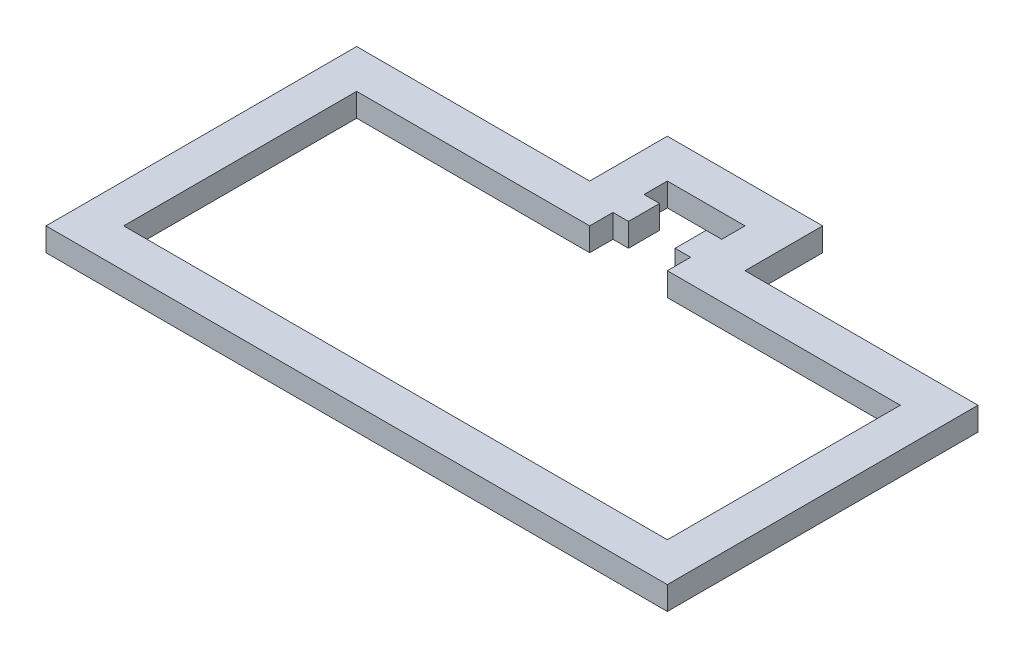
ISO-10303-21;
HEADER;
FILE_DESCRIPTION(('STEP AP214'),'2;1');
FILE_NAME('part.step','',(''),(''),'','','');
FILE_SCHEMA(('AUTOMOTIVE_DESIGN { 1 0 10303 214 1 1 1 1 }'));
ENDSEC;
DATA;
#1=APPLICATION_CONTEXT('core data for automotive mechanical design processes');
#2=APPLICATION_PROTOCOL_DEFINITION('international standard','automotive_design',2000,#1);
#3=PRODUCT_CONTEXT('',#1,'mechanical');
#4=PRODUCT('Part','Part','',(#3));
#5=PRODUCT_RELATED_PRODUCT_CATEGORY('part','',(#4));
#6=PRODUCT_DEFINITION_FORMATION('','',#4);
#7=PRODUCT_DEFINITION_CONTEXT('part definition',#1,'design');
#8=PRODUCT_DEFINITION('design','',#6,#7);
#9=PRODUCT_DEFINITION_SHAPE('','',#8);
#10=(LENGTH_UNIT() NAMED_UNIT(*) SI_UNIT(.MILLI.,.METRE.));
#11=(NAMED_UNIT(*) PLANE_ANGLE_UNIT() SI_UNIT($,.RADIAN.));
#12=(NAMED_UNIT(*) SI_UNIT($,.STERADIAN.) SOLID_ANGLE_UNIT());
#13=UNCERTAINTY_MEASURE_WITH_UNIT(LENGTH_MEASURE(1.E-05),#10,'distance_accuracy_value','');
#14=(GEOMETRIC_REPRESENTATION_CONTEXT(3) GLOBAL_UNCERTAINTY_ASSIGNED_CONTEXT((#13)) GLOBAL_UNIT_ASSIGNED_CONTEXT((#10,
#11,#12)) REPRESENTATION_CONTEXT('',''));
#15=CARTESIAN_POINT('',(0.,0.,0.));
#16=DIRECTION('',(0.,0.,1.));
#17=DIRECTION('',(1.,0.,0.));
#18=AXIS2_PLACEMENT_3D('',#15,#16,#17);
#19=CARTESIAN_POINT('',(50.1883239171375,30.,0.));
#20=DIRECTION('',(1.,0.,0.));
#21=DIRECTION('',(0.,0.,-1.));
#22=AXIS2_PLACEMENT_3D('',#19,#20,#21);
#23=PLANE('',#22);
#24=DIRECTION('',(0.,-1.,0.));
#25=VECTOR('',#24,1.);
#26=CARTESIAN_POINT('',(50.1883239171374,30.,-185.128212813281));
#27=LINE('',#26,#25);
#28=CARTESIAN_POINT('',(50.1883239171374,30.,-185.128212813281));
#29=VERTEX_POINT('',#28);
#30=CARTESIAN_POINT('',(50.1883239171374,0.,-185.128212813281));
#31=VERTEX_POINT('',#30);
#32=EDGE_CURVE('E12',#29,#31,#27,.T.);
#33=ORIENTED_EDGE('',*,*,#32,.F.);
#34=DIRECTION('',(0.,0.,1.));
#35=VECTOR('',#34,1.);
#36=CARTESIAN_POINT('',(50.1883239171375,30.,0.));
#37=LINE('',#36,#35);
#38=CARTESIAN_POINT('',(50.1883239171374,30.,-215.128212813281));
#39=VERTEX_POINT('',#38);
#40=EDGE_CURVE('E330',#39,#29,#37,.T.);
#41=ORIENTED_EDGE('',*,*,#40,.F.);
#42=DIRECTION('',(0.,-1.,0.));
#43=VECTOR('',#42,1.);
#44=CARTESIAN_POINT('',(50.1883239171374,30.,-215.128212813281));
#45=LINE('',#44,#43);
#46=CARTESIAN_POINT('',(50.1883239171374,0.,-215.128212813281));
#47=VERTEX_POINT('',#46);
#48=EDGE_CURVE('E220',#39,#47,#45,.T.);
#49=ORIENTED_EDGE('',*,*,#48,.T.);
#50=DIRECTION('',(0.,0.,1.));
#51=VECTOR('',#50,1.);
#52=CARTESIAN_POINT('',(50.1883239171375,0.,0.));
#53=LINE('',#52,#51);
#54=EDGE_CURVE('E287',#47,#31,#53,.T.);
#55=ORIENTED_EDGE('',*,*,#54,.T.);
#56=EDGE_LOOP('',(#33,#41,#49,#55));
#57=FACE_BOUND('',#56,.T.);
#58=ADVANCED_FACE('F109',(#57),#23,.F.);
#59=CARTESIAN_POINT('',(50.1883239171375,30.,-145.128212813281));
#60=VERTEX_POINT('',#59);
#61=CARTESIAN_POINT('',(50.1883239171375,30.,-115.128212813281));
#62=VERTEX_POINT('',#61);
#63=EDGE_CURVE('E333',#60,#62,#37,.T.);
#64=ORIENTED_EDGE('',*,*,#63,.F.);
#65=DIRECTION('',(0.,-1.,0.));
#66=VECTOR('',#65,1.);
#67=CARTESIAN_POINT('',(50.1883239171375,30.,-145.128212813281));
#68=LINE('',#67,#66);
#69=CARTESIAN_POINT('',(50.1883239171375,0.,-145.128212813281));
#70=VERTEX_POINT('',#69);
#71=EDGE_CURVE('E119',#60,#70,#68,.T.);
#72=ORIENTED_EDGE('',*,*,#71,.T.);
#73=CARTESIAN_POINT('',(50.1883239171375,0.,-115.128212813281));
#74=VERTEX_POINT('',#73);
#75=EDGE_CURVE('E185',#70,#74,#53,.T.);
#76=ORIENTED_EDGE('',*,*,#75,.T.);
#77=DIRECTION('',(0.,-1.,0.));
#78=VECTOR('',#77,1.);
#79=CARTESIAN_POINT('',(50.1883239171375,30.,-115.128212813281));
#80=LINE('',#79,#78);
#81=EDGE_CURVE('E249',#62,#74,#80,.T.);
#82=ORIENTED_EDGE('',*,*,#81,.F.);
#83=EDGE_LOOP('',(#64,#72,#76,#82));
#84=FACE_BOUND('',#83,.T.);
#85=ADVANCED_FACE('F457',(#84),#23,.F.);
#86=CARTESIAN_POINT('',(0.,30.,-115.128212813281));
#87=DIRECTION('',(0.,0.,-1.));
#88=DIRECTION('',(-1.,0.,0.));
#89=AXIS2_PLACEMENT_3D('',#86,#87,#88);
#90=PLANE('',#89);
#91=DIRECTION('',(1.,0.,0.));
#92=VECTOR('',#91,1.);
#93=CARTESIAN_POINT('',(0.,0.,-115.128212813281));
#94=LINE('',#93,#92);
#95=CARTESIAN_POINT('',(350.188323917137,0.,-115.128212813281));
#96=VERTEX_POINT('',#95);
#97=EDGE_CURVE('E284',#74,#96,#94,.T.);
#98=ORIENTED_EDGE('',*,*,#97,.T.);
#99=DIRECTION('',(0.,-1.,0.));
#100=VECTOR('',#99,1.);
#101=CARTESIAN_POINT('',(350.188323917137,30.,-115.128212813281));
#102=LINE('',#101,#100);
#103=CARTESIAN_POINT('',(350.188323917137,30.,-115.128212813281));
#104=VERTEX_POINT('',#103);
#105=EDGE_CURVE('E252',#104,#96,#102,.T.);
#106=ORIENTED_EDGE('',*,*,#105,.F.);
#107=DIRECTION('',(1.,0.,0.));
#108=VECTOR('',#107,1.);
#109=CARTESIAN_POINT('',(0.,30.,-115.128212813281));
#110=LINE('',#109,#108);
#111=EDGE_CURVE('E327',#62,#104,#110,.T.);
#112=ORIENTED_EDGE('',*,*,#111,.F.);
#113=ORIENTED_EDGE('',*,*,#81,.T.);
#114=EDGE_LOOP('',(#98,#106,#112,#113));
#115=FACE_BOUND('',#114,.T.);
#116=ADVANCED_FACE('F461',(#115),#90,.F.);
#117=CARTESIAN_POINT('',(350.188323917137,30.,0.));
#118=DIRECTION('',(1.,0.,0.));
#119=DIRECTION('',(0.,0.,-1.));
#120=AXIS2_PLACEMENT_3D('',#117,#118,#119);
#121=PLANE('',#120);
#122=DIRECTION('',(0.,0.,1.));
#123=VECTOR('',#122,1.);
#124=CARTESIAN_POINT('',(350.188323917137,0.,0.));
#125=LINE('',#124,#123);
#126=CARTESIAN_POINT('',(350.188323917137,0.,184.871787186719));
#127=VERTEX_POINT('',#126);
#128=EDGE_CURVE('E281',#96,#127,#125,.T.);
#129=ORIENTED_EDGE('',*,*,#128,.T.);
#130=DIRECTION('',(0.,-1.,0.));
#131=VECTOR('',#130,1.);
#132=CARTESIAN_POINT('',(350.188323917137,30.,184.871787186719));
#133=LINE('',#132,#131);
#134=CARTESIAN_POINT('',(350.188323917137,30.,184.871787186719));
#135=VERTEX_POINT('',#134);
#136=EDGE_CURVE('E255',#135,#127,#133,.T.);
#137=ORIENTED_EDGE('',*,*,#136,.F.);
#138=DIRECTION('',(0.,0.,1.));
#139=VECTOR('',#138,1.);
#140=CARTESIAN_POINT('',(350.188323917137,30.,0.));
#141=LINE('',#140,#139);
#142=EDGE_CURVE('E324',#104,#135,#141,.T.);
#143=ORIENTED_EDGE('',*,*,#142,.F.);
#144=ORIENTED_EDGE('',*,*,#105,.T.);
#145=EDGE_LOOP('',(#129,#137,#143,#144));
#146=FACE_BOUND('',#145,.T.);
#147=ADVANCED_FACE('F467',(#146),#121,.F.);
#148=CARTESIAN_POINT('',(0.,30.,184.871787186719));
#149=DIRECTION('',(0.,0.,-1.));
#150=DIRECTION('',(-1.,0.,0.));
#151=AXIS2_PLACEMENT_3D('',#148,#149,#150);
#152=PLANE('',#151);
#153=DIRECTION('',(1.,0.,0.));
#154=VECTOR('',#153,1.);
#155=CARTESIAN_POINT('',(0.,0.,184.871787186719));
#156=LINE('',#155,#154);
#157=CARTESIAN_POINT('',(-349.811676082863,0.,184.871787186719));
#158=VERTEX_POINT('',#157);
#159=EDGE_CURVE('E278',#158,#127,#156,.T.);
#160=ORIENTED_EDGE('',*,*,#159,.F.);
#161=DIRECTION('',(0.,-1.,0.));
#162=VECTOR('',#161,1.);
#163=CARTESIAN_POINT('',(-349.811676082863,30.,184.871787186719));
#164=LINE('',#163,#162);
#165=CARTESIAN_POINT('',(-349.811676082863,30.,184.871787186719));
#166=VERTEX_POINT('',#165);
#167=EDGE_CURVE('E258',#166,#158,#164,.T.);
#168=ORIENTED_EDGE('',*,*,#167,.F.);
#169=DIRECTION('',(1.,0.,0.));
#170=VECTOR('',#169,1.);
#171=CARTESIAN_POINT('',(0.,30.,184.871787186719));
#172=LINE('',#171,#170);
#173=EDGE_CURVE('E321',#166,#135,#172,.T.);
#174=ORIENTED_EDGE('',*,*,#173,.T.);
#175=ORIENTED_EDGE('',*,*,#136,.T.);
#176=EDGE_LOOP('',(#160,#168,#174,#175));
#177=FACE_BOUND('',#176,.T.);
#178=ADVANCED_FACE('F471',(#177),#152,.T.);
#179=CARTESIAN_POINT('',(-349.811676082863,30.,0.));
#180=DIRECTION('',(1.,0.,0.));
#181=DIRECTION('',(0.,0.,-1.));
#182=AXIS2_PLACEMENT_3D('',#179,#180,#181);
#183=PLANE('',#182);
#184=DIRECTION('',(0.,0.,1.));
#185=VECTOR('',#184,1.);
#186=CARTESIAN_POINT('',(-349.811676082863,0.,0.));
#187=LINE('',#186,#185);
#188=CARTESIAN_POINT('',(-349.811676082863,0.,-115.128212813281));
#189=VERTEX_POINT('',#188);
#190=EDGE_CURVE('E274',#189,#158,#187,.T.);
#191=ORIENTED_EDGE('',*,*,#190,.F.);
#192=DIRECTION('',(0.,-1.,0.));
#193=VECTOR('',#192,1.);
#194=CARTESIAN_POINT('',(-349.811676082863,30.,-115.128212813281));
#195=LINE('',#194,#193);
#196=CARTESIAN_POINT('',(-349.811676082863,30.,-115.128212813281));
#197=VERTEX_POINT('',#196);
#198=EDGE_CURVE('E261',#197,#189,#195,.T.);
#199=ORIENTED_EDGE('',*,*,#198,.F.);
#200=DIRECTION('',(0.,0.,1.));
#201=VECTOR('',#200,1.);
#202=CARTESIAN_POINT('',(-349.811676082863,30.,0.));
#203=LINE('',#202,#201);
#204=EDGE_CURVE('E317',#197,#166,#203,.T.);
#205=ORIENTED_EDGE('',*,*,#204,.T.);
#206=ORIENTED_EDGE('',*,*,#167,.T.);
#207=EDGE_LOOP('',(#191,#199,#205,#206));
#208=FACE_BOUND('',#207,.T.);
#209=ADVANCED_FACE('F474',(#208),#183,.T.);
#210=CARTESIAN_POINT('',(-49.8116760828625,0.,-115.128212813281));
#211=VERTEX_POINT('',#210);
#212=EDGE_CURVE('E277',#189,#211,#94,.T.);
#213=ORIENTED_EDGE('',*,*,#212,.T.);
#214=DIRECTION('',(0.,-1.,0.));
#215=VECTOR('',#214,1.);
#216=CARTESIAN_POINT('',(-49.8116760828625,30.,-115.128212813281));
#217=LINE('',#216,#215);
#218=CARTESIAN_POINT('',(-49.8116760828625,30.,-115.128212813281));
#219=VERTEX_POINT('',#218);
#220=EDGE_CURVE('E264',#219,#211,#217,.T.);
#221=ORIENTED_EDGE('',*,*,#220,.F.);
#222=EDGE_CURVE('E320',#197,#219,#110,.T.);
#223=ORIENTED_EDGE('',*,*,#222,.F.);
#224=ORIENTED_EDGE('',*,*,#198,.T.);
#225=EDGE_LOOP('',(#213,#221,#223,#224));
#226=FACE_BOUND('',#225,.T.);
#227=ADVANCED_FACE('F481',(#226),#90,.F.);
#228=CARTESIAN_POINT('',(-49.8116760828625,30.,0.));
#229=DIRECTION('',(1.,0.,0.));
#230=DIRECTION('',(0.,0.,-1.));
#231=AXIS2_PLACEMENT_3D('',#228,#229,#230);
#232=PLANE('',#231);
#233=DIRECTION('',(0.,0.,1.));
#234=VECTOR('',#233,1.);
#235=CARTESIAN_POINT('',(-49.8116760828625,0.,0.));
#236=LINE('',#235,#234);
#237=CARTESIAN_POINT('',(-49.8116760828626,0.,-145.128212813281));
#238=VERTEX_POINT('',#237);
#239=EDGE_CURVE('E273',#238,#211,#236,.T.);
#240=ORIENTED_EDGE('',*,*,#239,.F.);
#241=DIRECTION('',(0.,1.,0.));
#242=VECTOR('',#241,1.);
#243=CARTESIAN_POINT('',(-49.8116760828626,30.,-145.128212813281));
#244=LINE('',#243,#242);
#245=CARTESIAN_POINT('',(-49.8116760828626,30.,-145.128212813281));
#246=VERTEX_POINT('',#245);
#247=EDGE_CURVE('E128',#238,#246,#244,.T.);
#248=ORIENTED_EDGE('',*,*,#247,.T.);
#249=DIRECTION('',(0.,0.,1.));
#250=VECTOR('',#249,1.);
#251=CARTESIAN_POINT('',(-49.8116760828625,30.,0.));
#252=LINE('',#251,#250);
#253=EDGE_CURVE('E316',#246,#219,#252,.T.);
#254=ORIENTED_EDGE('',*,*,#253,.T.);
#255=ORIENTED_EDGE('',*,*,#220,.T.);
#256=EDGE_LOOP('',(#240,#248,#254,#255));
#257=FACE_BOUND('',#256,.T.);
#258=ADVANCED_FACE('F483',(#257),#232,.T.);
#259=DIRECTION('',(0.,1.,0.));
#260=VECTOR('',#259,1.);
#261=CARTESIAN_POINT('',(-49.8116760828626,30.,-185.128212813281));
#262=LINE('',#261,#260);
#263=CARTESIAN_POINT('',(-49.8116760828626,0.,-185.128212813281));
#264=VERTEX_POINT('',#263);
#265=CARTESIAN_POINT('',(-49.8116760828626,30.,-185.128212813281));
#266=VERTEX_POINT('',#265);
#267=EDGE_CURVE('E218',#264,#266,#262,.T.);
#268=ORIENTED_EDGE('',*,*,#267,.F.);
#269=CARTESIAN_POINT('',(-49.8116760828626,0.,-215.128212813281));
#270=VERTEX_POINT('',#269);
#271=EDGE_CURVE('E269',#270,#264,#236,.T.);
#272=ORIENTED_EDGE('',*,*,#271,.F.);
#273=DIRECTION('',(0.,-1.,0.));
#274=VECTOR('',#273,1.);
#275=CARTESIAN_POINT('',(-49.8116760828626,30.,-215.128212813281));
#276=LINE('',#275,#274);
#277=CARTESIAN_POINT('',(-49.8116760828626,30.,-215.128212813281));
#278=VERTEX_POINT('',#277);
#279=EDGE_CURVE('E224',#278,#270,#276,.T.);
#280=ORIENTED_EDGE('',*,*,#279,.F.);
#281=EDGE_CURVE('E246',#278,#266,#252,.T.);
#282=ORIENTED_EDGE('',*,*,#281,.T.);
#283=EDGE_LOOP('',(#268,#272,#280,#282));
#284=FACE_BOUND('',#283,.T.);
#285=ADVANCED_FACE('F497',(#284),#232,.T.);
#286=CARTESIAN_POINT('',(0.,30.,-215.128212813281));
#287=DIRECTION('',(0.,0.,-1.));
#288=DIRECTION('',(-1.,0.,0.));
#289=AXIS2_PLACEMENT_3D('',#286,#287,#288);
#290=PLANE('',#289);
#291=DIRECTION('',(1.,0.,0.));
#292=VECTOR('',#291,1.);
#293=CARTESIAN_POINT('',(0.,0.,-215.128212813281));
#294=LINE('',#293,#292);
#295=EDGE_CURVE('E290',#270,#47,#294,.T.);
#296=ORIENTED_EDGE('',*,*,#295,.T.);
#297=ORIENTED_EDGE('',*,*,#48,.F.);
#298=DIRECTION('',(1.,0.,0.));
#299=VECTOR('',#298,1.);
#300=CARTESIAN_POINT('',(0.,30.,-215.128212813281));
#301=LINE('',#300,#299);
#302=EDGE_CURVE('E334',#278,#39,#301,.T.);
#303=ORIENTED_EDGE('',*,*,#302,.F.);
#304=ORIENTED_EDGE('',*,*,#279,.T.);
#305=EDGE_LOOP('',(#296,#297,#303,#304));
#306=FACE_BOUND('',#305,.T.);
#307=ADVANCED_FACE('F503',(#306),#290,.F.);
#308=CARTESIAN_POINT('',(100.188323917137,30.,0.));
#309=DIRECTION('',(1.,0.,0.));
#310=DIRECTION('',(0.,0.,-1.));
#311=AXIS2_PLACEMENT_3D('',#308,#309,#310);
#312=PLANE('',#311);
#313=DIRECTION('',(0.,0.,1.));
#314=VECTOR('',#313,1.);
#315=CARTESIAN_POINT('',(100.188323917137,0.,0.));
#316=LINE('',#315,#314);
#317=CARTESIAN_POINT('',(100.188323917137,0.,-265.128212813281));
#318=VERTEX_POINT('',#317);
#319=CARTESIAN_POINT('',(100.188323917137,0.,-165.128212813281));
#320=VERTEX_POINT('',#319);
#321=EDGE_CURVE('E309',#318,#320,#316,.T.);
#322=ORIENTED_EDGE('',*,*,#321,.F.);
#323=DIRECTION('',(0.,-1.,0.));
#324=VECTOR('',#323,1.);
#325=CARTESIAN_POINT('',(100.188323917137,30.,-265.128212813281));
#326=LINE('',#325,#324);
#327=CARTESIAN_POINT('',(100.188323917137,30.,-265.128212813281));
#328=VERTEX_POINT('',#327);
#329=EDGE_CURVE('E225',#328,#318,#326,.T.);
#330=ORIENTED_EDGE('',*,*,#329,.F.);
#331=DIRECTION('',(0.,0.,1.));
#332=VECTOR('',#331,1.);
#333=CARTESIAN_POINT('',(100.188323917137,30.,0.));
#334=LINE('',#333,#332);
#335=CARTESIAN_POINT('',(100.188323917137,30.,-165.128212813281));
#336=VERTEX_POINT('',#335);
#337=EDGE_CURVE('E353',#328,#336,#334,.T.);
#338=ORIENTED_EDGE('',*,*,#337,.T.);
#339=DIRECTION('',(0.,-1.,0.));
#340=VECTOR('',#339,1.);
#341=CARTESIAN_POINT('',(100.188323917137,30.,-165.128212813281));
#342=LINE('',#341,#340);
#343=EDGE_CURVE('E221',#336,#320,#342,.T.);
#344=ORIENTED_EDGE('',*,*,#343,.T.);
#345=EDGE_LOOP('',(#322,#330,#338,#344));
#346=FACE_BOUND('',#345,.T.);
#347=ADVANCED_FACE('F533',(#346),#312,.T.);
#348=CARTESIAN_POINT('',(0.,30.,-265.128212813281));
#349=DIRECTION('',(0.,0.,-1.));
#350=DIRECTION('',(-1.,0.,0.));
#351=AXIS2_PLACEMENT_3D('',#348,#349,#350);
#352=PLANE('',#351);
#353=DIRECTION('',(1.,0.,0.));
#354=VECTOR('',#353,1.);
#355=CARTESIAN_POINT('',(0.,0.,-265.128212813281));
#356=LINE('',#355,#354);
#357=CARTESIAN_POINT('',(-99.8116760828626,0.,-265.128212813281));
#358=VERTEX_POINT('',#357);
#359=EDGE_CURVE('E306',#358,#318,#356,.T.);
#360=ORIENTED_EDGE('',*,*,#359,.F.);
#361=DIRECTION('',(0.,-1.,0.));
#362=VECTOR('',#361,1.);
#363=CARTESIAN_POINT('',(-99.8116760828626,30.,-265.128212813281));
#364=LINE('',#363,#362);
#365=CARTESIAN_POINT('',(-99.8116760828626,30.,-265.128212813281));
#366=VERTEX_POINT('',#365);
#367=EDGE_CURVE('E228',#366,#358,#364,.T.);
#368=ORIENTED_EDGE('',*,*,#367,.F.);
#369=DIRECTION('',(1.,0.,0.));
#370=VECTOR('',#369,1.);
#371=CARTESIAN_POINT('',(0.,30.,-265.128212813281));
#372=LINE('',#371,#370);
#373=EDGE_CURVE('E350',#366,#328,#372,.T.);
#374=ORIENTED_EDGE('',*,*,#373,.T.);
#375=ORIENTED_EDGE('',*,*,#329,.T.);
#376=EDGE_LOOP('',(#360,#368,#374,#375));
#377=FACE_BOUND('',#376,.T.);
#378=ADVANCED_FACE('F536',(#377),#352,.T.);
#379=CARTESIAN_POINT('',(-99.8116760828625,30.,0.));
#380=DIRECTION('',(1.,0.,0.));
#381=DIRECTION('',(0.,0.,-1.));
#382=AXIS2_PLACEMENT_3D('',#379,#380,#381);
#383=PLANE('',#382);
#384=DIRECTION('',(0.,0.,1.));
#385=VECTOR('',#384,1.);
#386=CARTESIAN_POINT('',(-99.8116760828625,0.,0.));
#387=LINE('',#386,#385);
#388=CARTESIAN_POINT('',(-99.8116760828626,0.,-165.128212813281));
#389=VERTEX_POINT('',#388);
#390=EDGE_CURVE('E303',#358,#389,#387,.T.);
#391=ORIENTED_EDGE('',*,*,#390,.T.);
#392=DIRECTION('',(0.,-1.,0.));
#393=VECTOR('',#392,1.);
#394=CARTESIAN_POINT('',(-99.8116760828626,30.,-165.128212813281));
#395=LINE('',#394,#393);
#396=CARTESIAN_POINT('',(-99.8116760828626,30.,-165.128212813281));
#397=VERTEX_POINT('',#396);
#398=EDGE_CURVE('E231',#397,#389,#395,.T.);
#399=ORIENTED_EDGE('',*,*,#398,.F.);
#400=DIRECTION('',(0.,0.,1.));
#401=VECTOR('',#400,1.);
#402=CARTESIAN_POINT('',(-99.8116760828625,30.,0.));
#403=LINE('',#402,#401);
#404=EDGE_CURVE('E347',#366,#397,#403,.T.);
#405=ORIENTED_EDGE('',*,*,#404,.F.);
#406=ORIENTED_EDGE('',*,*,#367,.T.);
#407=EDGE_LOOP('',(#391,#399,#405,#406));
#408=FACE_BOUND('',#407,.T.);
#409=ADVANCED_FACE('F540',(#408),#383,.F.);
#410=CARTESIAN_POINT('',(0.,30.,-165.128212813281));
#411=DIRECTION('',(0.,0.,-1.));
#412=DIRECTION('',(-1.,0.,0.));
#413=AXIS2_PLACEMENT_3D('',#410,#411,#412);
#414=PLANE('',#413);
#415=DIRECTION('',(1.,0.,0.));
#416=VECTOR('',#415,1.);
#417=CARTESIAN_POINT('',(0.,0.,-165.128212813281));
#418=LINE('',#417,#416);
#419=CARTESIAN_POINT('',(-399.811676082863,0.,-165.128212813281));
#420=VERTEX_POINT('',#419);
#421=EDGE_CURVE('E302',#420,#389,#418,.T.);
#422=ORIENTED_EDGE('',*,*,#421,.F.);
#423=DIRECTION('',(0.,-1.,0.));
#424=VECTOR('',#423,1.);
#425=CARTESIAN_POINT('',(-399.811676082863,30.,-165.128212813281));
#426=LINE('',#425,#424);
#427=CARTESIAN_POINT('',(-399.811676082863,30.,-165.128212813281));
#428=VERTEX_POINT('',#427);
#429=EDGE_CURVE('E234',#428,#420,#426,.T.);
#430=ORIENTED_EDGE('',*,*,#429,.F.);
#431=DIRECTION('',(1.,0.,0.));
#432=VECTOR('',#431,1.);
#433=CARTESIAN_POINT('',(0.,30.,-165.128212813281));
#434=LINE('',#433,#432);
#435=EDGE_CURVE('E346',#428,#397,#434,.T.);
#436=ORIENTED_EDGE('',*,*,#435,.T.);
#437=ORIENTED_EDGE('',*,*,#398,.T.);
#438=EDGE_LOOP('',(#422,#430,#436,#437));
#439=FACE_BOUND('',#438,.T.);
#440=ADVANCED_FACE('F368',(#439),#414,.T.);
#441=CARTESIAN_POINT('',(-399.811676082863,30.,0.));
#442=DIRECTION('',(1.,0.,0.));
#443=DIRECTION('',(0.,0.,-1.));
#444=AXIS2_PLACEMENT_3D('',#441,#442,#443);
#445=PLANE('',#444);
#446=DIRECTION('',(0.,0.,1.));
#447=VECTOR('',#446,1.);
#448=CARTESIAN_POINT('',(-399.811676082863,0.,0.));
#449=LINE('',#448,#447);
#450=CARTESIAN_POINT('',(-399.811676082863,0.,234.871787186719));
#451=VERTEX_POINT('',#450);
#452=EDGE_CURVE('E299',#420,#451,#449,.T.);
#453=ORIENTED_EDGE('',*,*,#452,.T.);
#454=DIRECTION('',(0.,-1.,0.));
#455=VECTOR('',#454,1.);
#456=CARTESIAN_POINT('',(-399.811676082863,30.,234.871787186719));
#457=LINE('',#456,#455);
#458=CARTESIAN_POINT('',(-399.811676082863,30.,234.871787186719));
#459=VERTEX_POINT('',#458);
#460=EDGE_CURVE('E237',#459,#451,#457,.T.);
#461=ORIENTED_EDGE('',*,*,#460,.F.);
#462=DIRECTION('',(0.,0.,1.));
#463=VECTOR('',#462,1.);
#464=CARTESIAN_POINT('',(-399.811676082863,30.,0.));
#465=LINE('',#464,#463);
#466=EDGE_CURVE('E343',#428,#459,#465,.T.);
#467=ORIENTED_EDGE('',*,*,#466,.F.);
#468=ORIENTED_EDGE('',*,*,#429,.T.);
#469=EDGE_LOOP('',(#453,#461,#467,#468));
#470=FACE_BOUND('',#469,.T.);
#471=ADVANCED_FACE('F547',(#470),#445,.F.);
#472=CARTESIAN_POINT('',(0.,30.,234.871787186719));
#473=DIRECTION('',(0.,0.,-1.));
#474=DIRECTION('',(-1.,0.,0.));
#475=AXIS2_PLACEMENT_3D('',#472,#473,#474);
#476=PLANE('',#475);
#477=DIRECTION('',(1.,0.,0.));
#478=VECTOR('',#477,1.);
#479=CARTESIAN_POINT('',(0.,0.,234.871787186719));
#480=LINE('',#479,#478);
#481=CARTESIAN_POINT('',(400.188323917138,0.,234.871787186719));
#482=VERTEX_POINT('',#481);
#483=EDGE_CURVE('E296',#451,#482,#480,.T.);
#484=ORIENTED_EDGE('',*,*,#483,.T.);
#485=DIRECTION('',(0.,-1.,0.));
#486=VECTOR('',#485,1.);
#487=CARTESIAN_POINT('',(400.188323917138,30.,234.871787186719));
#488=LINE('',#487,#486);
#489=CARTESIAN_POINT('',(400.188323917138,30.,234.871787186719));
#490=VERTEX_POINT('',#489);
#491=EDGE_CURVE('E240',#490,#482,#488,.T.);
#492=ORIENTED_EDGE('',*,*,#491,.F.);
#493=DIRECTION('',(1.,0.,0.));
#494=VECTOR('',#493,1.);
#495=CARTESIAN_POINT('',(0.,30.,234.871787186719));
#496=LINE('',#495,#494);
#497=EDGE_CURVE('E340',#459,#490,#496,.T.);
#498=ORIENTED_EDGE('',*,*,#497,.F.);
#499=ORIENTED_EDGE('',*,*,#460,.T.);
#500=EDGE_LOOP('',(#484,#492,#498,#499));
#501=FACE_BOUND('',#500,.T.);
#502=ADVANCED_FACE('F550',(#501),#476,.F.);
#503=CARTESIAN_POINT('',(400.188323917137,30.,-1.11074572849739E-13));
#504=DIRECTION('',(1.,0.,0.));
#505=DIRECTION('',(0.,0.,-1.));
#506=AXIS2_PLACEMENT_3D('',#503,#504,#505);
#507=PLANE('',#506);
#508=DIRECTION('',(0.,0.,1.));
#509=VECTOR('',#508,1.);
#510=CARTESIAN_POINT('',(400.188323917137,0.,-1.11074572849739E-13));
#511=LINE('',#510,#509);
#512=CARTESIAN_POINT('',(400.188323917137,0.,-165.128212813281));
#513=VERTEX_POINT('',#512);
#514=EDGE_CURVE('E293',#513,#482,#511,.T.);
#515=ORIENTED_EDGE('',*,*,#514,.F.);
#516=DIRECTION('',(0.,-1.,0.));
#517=VECTOR('',#516,1.);
#518=CARTESIAN_POINT('',(400.188323917137,30.,-165.128212813281));
#519=LINE('',#518,#517);
#520=CARTESIAN_POINT('',(400.188323917137,30.,-165.128212813281));
#521=VERTEX_POINT('',#520);
#522=EDGE_CURVE('E243',#521,#513,#519,.T.);
#523=ORIENTED_EDGE('',*,*,#522,.F.);
#524=DIRECTION('',(0.,0.,1.));
#525=VECTOR('',#524,1.);
#526=CARTESIAN_POINT('',(400.188323917137,30.,-1.11074572849739E-13));
#527=LINE('',#526,#525);
#528=EDGE_CURVE('E337',#521,#490,#527,.T.);
#529=ORIENTED_EDGE('',*,*,#528,.T.);
#530=ORIENTED_EDGE('',*,*,#491,.T.);
#531=EDGE_LOOP('',(#515,#523,#529,#530));
#532=FACE_BOUND('',#531,.T.);
#533=ADVANCED_FACE('F554',(#532),#507,.T.);
#534=EDGE_CURVE('E200',#320,#513,#418,.T.);
#535=ORIENTED_EDGE('',*,*,#534,.F.);
#536=ORIENTED_EDGE('',*,*,#343,.F.);
#537=EDGE_CURVE('E272',#336,#521,#434,.T.);
#538=ORIENTED_EDGE('',*,*,#537,.T.);
#539=ORIENTED_EDGE('',*,*,#522,.T.);
#540=EDGE_LOOP('',(#535,#536,#538,#539));
#541=FACE_BOUND('',#540,.T.);
#542=ADVANCED_FACE('F524',(#541),#414,.T.);
#543=CARTESIAN_POINT('',(0.,0.,0.));
#544=DIRECTION('',(0.,1.,0.));
#545=DIRECTION('',(0.,0.,1.));
#546=AXIS2_PLACEMENT_3D('',#543,#544,#545);
#547=PLANE('',#546);
#548=ORIENTED_EDGE('',*,*,#534,.T.);
#549=ORIENTED_EDGE('',*,*,#514,.T.);
#550=ORIENTED_EDGE('',*,*,#483,.F.);
#551=ORIENTED_EDGE('',*,*,#452,.F.);
#552=ORIENTED_EDGE('',*,*,#421,.T.);
#553=ORIENTED_EDGE('',*,*,#390,.F.);
#554=ORIENTED_EDGE('',*,*,#359,.T.);
#555=ORIENTED_EDGE('',*,*,#321,.T.);
#556=EDGE_LOOP('',(#548,#549,#550,#551,#552,#553,#554,#555));
#557=FACE_BOUND('',#556,.T.);
#558=ORIENTED_EDGE('',*,*,#295,.F.);
#559=ORIENTED_EDGE('',*,*,#271,.T.);
#560=DIRECTION('',(1.,0.,0.));
#561=VECTOR('',#560,1.);
#562=CARTESIAN_POINT('',(-49.8116760828626,0.,-185.128212813281));
#563=LINE('',#562,#561);
#564=CARTESIAN_POINT('',(-29.8116760828626,0.,-185.128212813281));
#565=VERTEX_POINT('',#564);
#566=EDGE_CURVE('E207',#264,#565,#563,.T.);
#567=ORIENTED_EDGE('',*,*,#566,.T.);
#568=DIRECTION('',(0.,0.,-1.));
#569=VECTOR('',#568,1.);
#570=CARTESIAN_POINT('',(-29.8116760828626,0.,-145.128212813281));
#571=LINE('',#570,#569);
#572=CARTESIAN_POINT('',(-29.8116760828626,0.,-145.128212813281));
#573=VERTEX_POINT('',#572);
#574=EDGE_CURVE('E204',#573,#565,#571,.T.);
#575=ORIENTED_EDGE('',*,*,#574,.F.);
#576=DIRECTION('',(1.,0.,0.));
#577=VECTOR('',#576,1.);
#578=CARTESIAN_POINT('',(-49.8116760828626,0.,-145.128212813281));
#579=LINE('',#578,#577);
#580=EDGE_CURVE('E201',#238,#573,#579,.T.);
#581=ORIENTED_EDGE('',*,*,#580,.F.);
#582=ORIENTED_EDGE('',*,*,#239,.T.);
#583=ORIENTED_EDGE('',*,*,#212,.F.);
#584=ORIENTED_EDGE('',*,*,#190,.T.);
#585=ORIENTED_EDGE('',*,*,#159,.T.);
#586=ORIENTED_EDGE('',*,*,#128,.F.);
#587=ORIENTED_EDGE('',*,*,#97,.F.);
#588=ORIENTED_EDGE('',*,*,#75,.F.);
#589=DIRECTION('',(-1.,0.,0.));
#590=VECTOR('',#589,1.);
#591=CARTESIAN_POINT('',(50.1883239171375,0.,-145.128212813281));
#592=LINE('',#591,#590);
#593=CARTESIAN_POINT('',(30.1883239171375,0.,-145.128212813281));
#594=VERTEX_POINT('',#593);
#595=EDGE_CURVE('E169',#70,#594,#592,.T.);
#596=ORIENTED_EDGE('',*,*,#595,.T.);
#597=DIRECTION('',(0.,0.,-1.));
#598=VECTOR('',#597,1.);
#599=CARTESIAN_POINT('',(30.1883239171375,0.,-145.128212813281));
#600=LINE('',#599,#598);
#601=CARTESIAN_POINT('',(30.1883239171375,0.,-185.128212813281));
#602=VERTEX_POINT('',#601);
#603=EDGE_CURVE('E175',#594,#602,#600,.T.);
#604=ORIENTED_EDGE('',*,*,#603,.T.);
#605=DIRECTION('',(-1.,0.,0.));
#606=VECTOR('',#605,1.);
#607=CARTESIAN_POINT('',(50.1883239171375,0.,-185.128212813281));
#608=LINE('',#607,#606);
#609=EDGE_CURVE('E179',#31,#602,#608,.T.);
#610=ORIENTED_EDGE('',*,*,#609,.F.);
#611=ORIENTED_EDGE('',*,*,#54,.F.);
#612=EDGE_LOOP('',(#558,#559,#567,#575,#581,#582,#583,#584,#585,#586,#587,#588,#596,#604,#610,#611));
#613=FACE_BOUND('',#612,.T.);
#614=ADVANCED_FACE('F182',(#557,#613),#547,.F.);
#615=CARTESIAN_POINT('',(0.,30.,0.));
#616=DIRECTION('',(0.,1.,0.));
#617=DIRECTION('',(0.,0.,1.));
#618=AXIS2_PLACEMENT_3D('',#615,#616,#617);
#619=PLANE('',#618);
#620=ORIENTED_EDGE('',*,*,#537,.F.);
#621=ORIENTED_EDGE('',*,*,#337,.F.);
#622=ORIENTED_EDGE('',*,*,#373,.F.);
#623=ORIENTED_EDGE('',*,*,#404,.T.);
#624=ORIENTED_EDGE('',*,*,#435,.F.);
#625=ORIENTED_EDGE('',*,*,#466,.T.);
#626=ORIENTED_EDGE('',*,*,#497,.T.);
#627=ORIENTED_EDGE('',*,*,#528,.F.);
#628=EDGE_LOOP('',(#620,#621,#622,#623,#624,#625,#626,#627));
#629=FACE_BOUND('',#628,.T.);
#630=ORIENTED_EDGE('',*,*,#302,.T.);
#631=ORIENTED_EDGE('',*,*,#40,.T.);
#632=DIRECTION('',(-1.,0.,0.));
#633=VECTOR('',#632,1.);
#634=CARTESIAN_POINT('',(50.1883239171375,30.,-185.128212813281));
#635=LINE('',#634,#633);
#636=CARTESIAN_POINT('',(30.1883239171375,30.,-185.128212813281));
#637=VERTEX_POINT('',#636);
#638=EDGE_CURVE('E186',#29,#637,#635,.T.);
#639=ORIENTED_EDGE('',*,*,#638,.T.);
#640=DIRECTION('',(0.,0.,-1.));
#641=VECTOR('',#640,1.);
#642=CARTESIAN_POINT('',(30.1883239171375,30.,-145.128212813281));
#643=LINE('',#642,#641);
#644=CARTESIAN_POINT('',(30.1883239171375,30.,-145.128212813281));
#645=VERTEX_POINT('',#644);
#646=EDGE_CURVE('E188',#645,#637,#643,.T.);
#647=ORIENTED_EDGE('',*,*,#646,.F.);
#648=DIRECTION('',(-1.,0.,0.));
#649=VECTOR('',#648,1.);
#650=CARTESIAN_POINT('',(50.1883239171375,30.,-145.128212813281));
#651=LINE('',#650,#649);
#652=EDGE_CURVE('E172',#60,#645,#651,.T.);
#653=ORIENTED_EDGE('',*,*,#652,.F.);
#654=ORIENTED_EDGE('',*,*,#63,.T.);
#655=ORIENTED_EDGE('',*,*,#111,.T.);
#656=ORIENTED_EDGE('',*,*,#142,.T.);
#657=ORIENTED_EDGE('',*,*,#173,.F.);
#658=ORIENTED_EDGE('',*,*,#204,.F.);
#659=ORIENTED_EDGE('',*,*,#222,.T.);
#660=ORIENTED_EDGE('',*,*,#253,.F.);
#661=DIRECTION('',(1.,0.,0.));
#662=VECTOR('',#661,1.);
#663=CARTESIAN_POINT('',(-49.8116760828626,30.,-145.128212813281));
#664=LINE('',#663,#662);
#665=CARTESIAN_POINT('',(-29.8116760828626,30.,-145.128212813281));
#666=VERTEX_POINT('',#665);
#667=EDGE_CURVE('E197',#246,#666,#664,.T.);
#668=ORIENTED_EDGE('',*,*,#667,.T.);
#669=DIRECTION('',(0.,0.,-1.));
#670=VECTOR('',#669,1.);
#671=CARTESIAN_POINT('',(-29.8116760828626,30.,-145.128212813281));
#672=LINE('',#671,#670);
#673=CARTESIAN_POINT('',(-29.8116760828626,30.,-185.128212813281));
#674=VERTEX_POINT('',#673);
#675=EDGE_CURVE('E211',#666,#674,#672,.T.);
#676=ORIENTED_EDGE('',*,*,#675,.T.);
#677=DIRECTION('',(1.,0.,0.));
#678=VECTOR('',#677,1.);
#679=CARTESIAN_POINT('',(-49.8116760828626,30.,-185.128212813281));
#680=LINE('',#679,#678);
#681=EDGE_CURVE('E203',#266,#674,#680,.T.);
#682=ORIENTED_EDGE('',*,*,#681,.F.);
#683=ORIENTED_EDGE('',*,*,#281,.F.);
#684=EDGE_LOOP('',(#630,#631,#639,#647,#653,#654,#655,#656,#657,#658,#659,#660,#668,#676,#682,#683));
#685=FACE_BOUND('',#684,.T.);
#686=ADVANCED_FACE('F376',(#629,#685),#619,.T.);
#687=CARTESIAN_POINT('',(50.1883239171375,30.,-185.128212813281));
#688=DIRECTION('',(0.,0.,1.));
#689=DIRECTION('',(1.,0.,0.));
#690=AXIS2_PLACEMENT_3D('',#687,#688,#689);
#691=PLANE('',#690);
#692=ORIENTED_EDGE('',*,*,#609,.T.);
#693=DIRECTION('',(0.,-1.,0.));
#694=VECTOR('',#693,1.);
#695=CARTESIAN_POINT('',(30.1883239171375,30.,-185.128212813281));
#696=LINE('',#695,#694);
#697=EDGE_CURVE('E113',#637,#602,#696,.T.);
#698=ORIENTED_EDGE('',*,*,#697,.F.);
#699=ORIENTED_EDGE('',*,*,#638,.F.);
#700=ORIENTED_EDGE('',*,*,#32,.T.);
#701=EDGE_LOOP('',(#692,#698,#699,#700));
#702=FACE_BOUND('',#701,.T.);
#703=ADVANCED_FACE('F111',(#702),#691,.F.);
#704=CARTESIAN_POINT('',(30.1883239171375,30.,-145.128212813281));
#705=DIRECTION('',(-1.,0.,0.));
#706=DIRECTION('',(0.,0.,1.));
#707=AXIS2_PLACEMENT_3D('',#704,#705,#706);
#708=PLANE('',#707);
#709=ORIENTED_EDGE('',*,*,#603,.F.);
#710=DIRECTION('',(0.,-1.,0.));
#711=VECTOR('',#710,1.);
#712=CARTESIAN_POINT('',(30.1883239171375,30.,-145.128212813281));
#713=LINE('',#712,#711);
#714=EDGE_CURVE('E164',#645,#594,#713,.T.);
#715=ORIENTED_EDGE('',*,*,#714,.F.);
#716=ORIENTED_EDGE('',*,*,#646,.T.);
#717=ORIENTED_EDGE('',*,*,#697,.T.);
#718=EDGE_LOOP('',(#709,#715,#716,#717));
#719=FACE_BOUND('',#718,.T.);
#720=ADVANCED_FACE('F176',(#719),#708,.T.);
#721=CARTESIAN_POINT('',(50.1883239171375,30.,-145.128212813281));
#722=DIRECTION('',(0.,0.,1.));
#723=DIRECTION('',(1.,0.,0.));
#724=AXIS2_PLACEMENT_3D('',#721,#722,#723);
#725=PLANE('',#724);
#726=ORIENTED_EDGE('',*,*,#595,.F.);
#727=ORIENTED_EDGE('',*,*,#71,.F.);
#728=ORIENTED_EDGE('',*,*,#652,.T.);
#729=ORIENTED_EDGE('',*,*,#714,.T.);
#730=EDGE_LOOP('',(#726,#727,#728,#729));
#731=FACE_BOUND('',#730,.T.);
#732=ADVANCED_FACE('F165',(#731),#725,.T.);
#733=CARTESIAN_POINT('',(-49.8116760828626,30.,-145.128212813281));
#734=DIRECTION('',(0.,0.,-1.));
#735=DIRECTION('',(-1.,0.,0.));
#736=AXIS2_PLACEMENT_3D('',#733,#734,#735);
#737=PLANE('',#736);
#738=ORIENTED_EDGE('',*,*,#580,.T.);
#739=DIRECTION('',(0.,-1.,0.));
#740=VECTOR('',#739,1.);
#741=CARTESIAN_POINT('',(-29.8116760828626,30.,-145.128212813281));
#742=LINE('',#741,#740);
#743=EDGE_CURVE('E196',#666,#573,#742,.T.);
#744=ORIENTED_EDGE('',*,*,#743,.F.);
#745=ORIENTED_EDGE('',*,*,#667,.F.);
#746=ORIENTED_EDGE('',*,*,#247,.F.);
#747=EDGE_LOOP('',(#738,#744,#745,#746));
#748=FACE_BOUND('',#747,.T.);
#749=ADVANCED_FACE('F488',(#748),#737,.F.);
#750=CARTESIAN_POINT('',(-29.8116760828626,30.,-145.128212813281));
#751=DIRECTION('',(-1.,0.,0.));
#752=DIRECTION('',(0.,0.,1.));
#753=AXIS2_PLACEMENT_3D('',#750,#751,#752);
#754=PLANE('',#753);
#755=ORIENTED_EDGE('',*,*,#574,.T.);
#756=DIRECTION('',(0.,-1.,0.));
#757=VECTOR('',#756,1.);
#758=CARTESIAN_POINT('',(-29.8116760828626,30.,-185.128212813281));
#759=LINE('',#758,#757);
#760=EDGE_CURVE('E194',#674,#565,#759,.T.);
#761=ORIENTED_EDGE('',*,*,#760,.F.);
#762=ORIENTED_EDGE('',*,*,#675,.F.);
#763=ORIENTED_EDGE('',*,*,#743,.T.);
#764=EDGE_LOOP('',(#755,#761,#762,#763));
#765=FACE_BOUND('',#764,.T.);
#766=ADVANCED_FACE('F491',(#765),#754,.F.);
#767=CARTESIAN_POINT('',(-49.8116760828626,30.,-185.128212813281));
#768=DIRECTION('',(0.,0.,-1.));
#769=DIRECTION('',(-1.,0.,0.));
#770=AXIS2_PLACEMENT_3D('',#767,#768,#769);
#771=PLANE('',#770);
#772=ORIENTED_EDGE('',*,*,#566,.F.);
#773=ORIENTED_EDGE('',*,*,#267,.T.);
#774=ORIENTED_EDGE('',*,*,#681,.T.);
#775=ORIENTED_EDGE('',*,*,#760,.T.);
#776=EDGE_LOOP('',(#772,#773,#774,#775));
#777=FACE_BOUND('',#776,.T.);
#778=ADVANCED_FACE('F507',(#777),#771,.T.);
#779=CLOSED_SHELL('',(#58,#85,#116,#147,#178,#209,#227,#258,#285,#307,#347,#378,#409,#440,#471,
#502,#533,#542,#614,#686,#703,#720,#732,#749,#766,#778));
#780=MANIFOLD_SOLID_BREP('B2',#779);
#781=ADVANCED_BREP_SHAPE_REPRESENTATION('',(#18,#780),#14);
#782=SHAPE_DEFINITION_REPRESENTATION(#9,#781);
ENDSEC;
END-ISO-10303-21;
